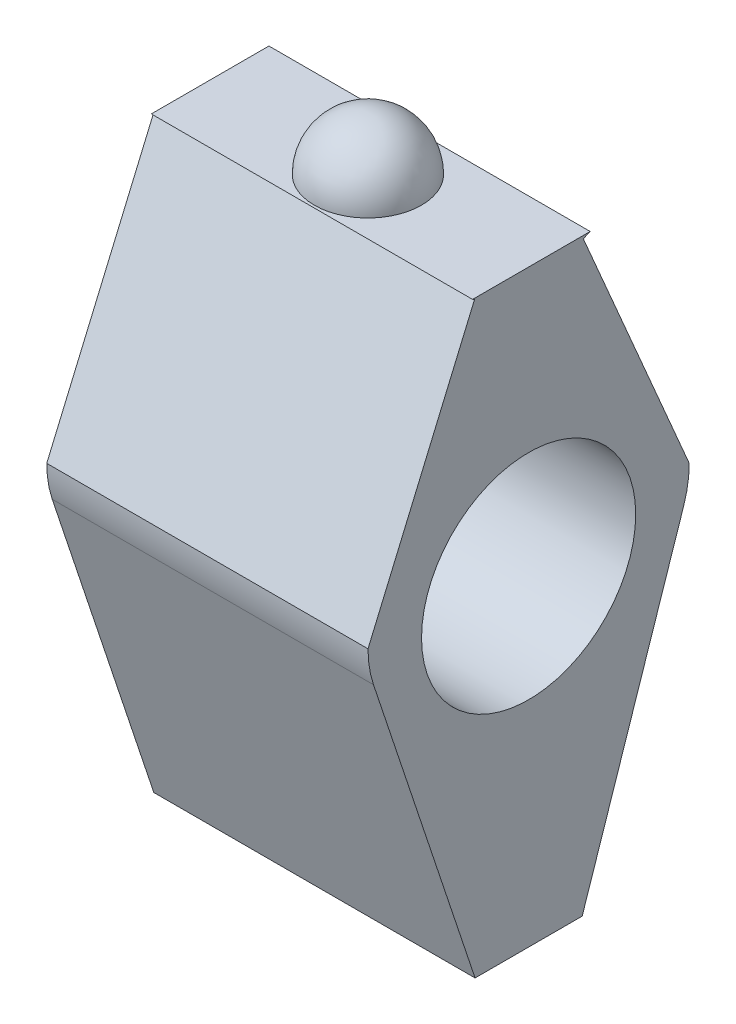
ISO-10303-21;
HEADER;
FILE_DESCRIPTION(('STEP AP214'),'2;1');
FILE_NAME('part.step','',(''),(''),'','','');
FILE_SCHEMA(('AUTOMOTIVE_DESIGN { 1 0 10303 214 1 1 1 1 }'));
ENDSEC;
DATA;
#1=APPLICATION_CONTEXT('core data for automotive mechanical design processes');
#2=APPLICATION_PROTOCOL_DEFINITION('international standard','automotive_design',2000,#1);
#3=PRODUCT_CONTEXT('',#1,'mechanical');
#4=PRODUCT('Part','Part','',(#3));
#5=PRODUCT_RELATED_PRODUCT_CATEGORY('part','',(#4));
#6=PRODUCT_DEFINITION_FORMATION('','',#4);
#7=PRODUCT_DEFINITION_CONTEXT('part definition',#1,'design');
#8=PRODUCT_DEFINITION('design','',#6,#7);
#9=PRODUCT_DEFINITION_SHAPE('','',#8);
#10=(LENGTH_UNIT() NAMED_UNIT(*) SI_UNIT(.MILLI.,.METRE.));
#11=(NAMED_UNIT(*) PLANE_ANGLE_UNIT() SI_UNIT($,.RADIAN.));
#12=(NAMED_UNIT(*) SI_UNIT($,.STERADIAN.) SOLID_ANGLE_UNIT());
#13=UNCERTAINTY_MEASURE_WITH_UNIT(LENGTH_MEASURE(1.E-05),#10,'distance_accuracy_value','');
#14=(GEOMETRIC_REPRESENTATION_CONTEXT(3) GLOBAL_UNCERTAINTY_ASSIGNED_CONTEXT((#13)) GLOBAL_UNIT_ASSIGNED_CONTEXT((#10,
#11,#12)) REPRESENTATION_CONTEXT('',''));
#15=CARTESIAN_POINT('',(0.,0.,0.));
#16=DIRECTION('',(0.,0.,1.));
#17=DIRECTION('',(1.,0.,0.));
#18=AXIS2_PLACEMENT_3D('',#15,#16,#17);
#19=CARTESIAN_POINT('',(-38.1,76.2,76.2));
#20=DIRECTION('',(1.,0.,0.));
#21=DIRECTION('',(0.,1.,0.));
#22=AXIS2_PLACEMENT_3D('',#19,#20,#21);
#23=PLANE('',#22);
#24=CARTESIAN_POINT('',(-38.1,0.,38.1));
#25=DIRECTION('',(1.,0.,0.));
#26=DIRECTION('',(0.,1.,0.));
#27=AXIS2_PLACEMENT_3D('',#24,#25,#26);
#28=CIRCLE('',#27,25.4);
#29=CARTESIAN_POINT('',(-38.1,25.4,38.1));
#30=VERTEX_POINT('',#29);
#31=EDGE_CURVE('E172',#30,#30,#28,.T.);
#32=ORIENTED_EDGE('',*,*,#31,.T.);
#33=EDGE_LOOP('',(#32));
#34=FACE_BOUND('',#33,.T.);
#35=DIRECTION('',(0.,0.393600027716465,-0.91928179476241));
#36=VECTOR('',#35,1.);
#37=CARTESIAN_POINT('',(-38.1,46.398740013951,63.4402816814989));
#38=LINE('',#37,#36);
#39=CARTESIAN_POINT('',(-38.1,62.8037183463836,25.1252490023325));
#40=VERTEX_POINT('',#39);
#41=CARTESIAN_POINT('',(-38.1,63.5,23.4990320228518));
#42=VERTEX_POINT('',#41);
#43=EDGE_CURVE('E51',#40,#42,#38,.T.);
#44=ORIENTED_EDGE('',*,*,#43,.F.);
#45=DIRECTION('',(0.,0.91928179476241,0.393600027716465));
#46=VECTOR('',#45,1.);
#47=CARTESIAN_POINT('',(-38.1,92.6049783324327,37.8849673208336));
#48=LINE('',#47,#46);
#49=CARTESIAN_POINT('',(-38.1,4.12185256827685,0.));
#50=VERTEX_POINT('',#49);
#51=EDGE_CURVE('E115',#50,#40,#48,.T.);
#52=ORIENTED_EDGE('',*,*,#51,.F.);
#53=CARTESIAN_POINT('',(-38.1,4.12185256827683,25.4));
#54=DIRECTION('',(1.,0.,0.));
#55=DIRECTION('',(0.,1.,0.));
#56=AXIS2_PLACEMENT_3D('',#53,#54,#55);
#57=CIRCLE('',#56,25.4);
#58=CARTESIAN_POINT('',(-38.1,-3.91033268855086,1.30344422951695));
#59=VERTEX_POINT('',#58);
#60=EDGE_CURVE('E193',#50,#59,#57,.F.);
#61=ORIENTED_EDGE('',*,*,#60,.T.);
#62=DIRECTION('',(0.,-0.948683298050514,0.316227766016838));
#63=VECTOR('',#62,1.);
#64=CARTESIAN_POINT('',(-38.1,0.,0.));
#65=LINE('',#64,#63);
#66=CARTESIAN_POINT('',(-38.1,-76.2,25.4));
#67=VERTEX_POINT('',#66);
#68=EDGE_CURVE('E167',#59,#67,#65,.T.);
#69=ORIENTED_EDGE('',*,*,#68,.T.);
#70=DIRECTION('',(0.,0.,-1.));
#71=VECTOR('',#70,1.);
#72=CARTESIAN_POINT('',(-38.1,-76.2,76.2));
#73=LINE('',#72,#71);
#74=CARTESIAN_POINT('',(-38.1,-76.2,50.8));
#75=VERTEX_POINT('',#74);
#76=EDGE_CURVE('E178',#75,#67,#73,.T.);
#77=ORIENTED_EDGE('',*,*,#76,.F.);
#78=DIRECTION('',(0.,0.948683298050514,0.316227766016838));
#79=VECTOR('',#78,1.);
#80=CARTESIAN_POINT('',(-38.1,0.,76.2));
#81=LINE('',#80,#79);
#82=CARTESIAN_POINT('',(-38.1,-3.91033268855087,74.896555770483));
#83=VERTEX_POINT('',#82);
#84=EDGE_CURVE('E155',#75,#83,#81,.T.);
#85=ORIENTED_EDGE('',*,*,#84,.T.);
#86=CARTESIAN_POINT('',(-38.1,4.12185256827682,50.8));
#87=DIRECTION('',(1.,0.,0.));
#88=DIRECTION('',(0.,1.,0.));
#89=AXIS2_PLACEMENT_3D('',#86,#87,#88);
#90=CIRCLE('',#89,25.4);
#91=CARTESIAN_POINT('',(-38.1,4.12185256827687,76.2));
#92=VERTEX_POINT('',#91);
#93=EDGE_CURVE('E190',#83,#92,#90,.F.);
#94=ORIENTED_EDGE('',*,*,#93,.T.);
#95=DIRECTION('',(0.,0.919543483974544,-0.392988270919067));
#96=VECTOR('',#95,1.);
#97=CARTESIAN_POINT('',(-38.1,65.0682666899958,50.153134004183));
#98=LINE('',#97,#96);
#99=CARTESIAN_POINT('',(-38.1,63.2914199916073,50.9125107208443));
#100=VERTEX_POINT('',#99);
#101=EDGE_CURVE('E144',#92,#100,#98,.T.);
#102=ORIENTED_EDGE('',*,*,#101,.T.);
#103=DIRECTION('',(0.,0.392988270919067,0.919543483974544));
#104=VECTOR('',#103,1.);
#105=CARTESIAN_POINT('',(-38.1,74.4231533016115,76.9593767166614));
#106=LINE('',#105,#104);
#107=CARTESIAN_POINT('',(-38.1,63.5,51.4005618964082));
#108=VERTEX_POINT('',#107);
#109=EDGE_CURVE('E139',#100,#108,#106,.T.);
#110=ORIENTED_EDGE('',*,*,#109,.T.);
#111=DIRECTION('',(0.,0.,1.));
#112=VECTOR('',#111,1.);
#113=CARTESIAN_POINT('',(-38.1,63.5,0.));
#114=LINE('',#113,#112);
#115=EDGE_CURVE('E132',#42,#108,#114,.T.);
#116=ORIENTED_EDGE('',*,*,#115,.F.);
#117=EDGE_LOOP('',(#44,#52,#61,#69,#77,#85,#94,#102,#110,#116));
#118=FACE_BOUND('',#117,.T.);
#119=ADVANCED_FACE('F36',(#34,#118),#23,.F.);
#120=CARTESIAN_POINT('',(38.1,76.2,76.2));
#121=DIRECTION('',(-1.,0.,0.));
#122=DIRECTION('',(0.,0.,1.));
#123=AXIS2_PLACEMENT_3D('',#120,#121,#122);
#124=PLANE('',#123);
#125=CARTESIAN_POINT('',(38.1,0.,38.1));
#126=DIRECTION('',(1.,0.,0.));
#127=DIRECTION('',(0.,0.,-1.));
#128=AXIS2_PLACEMENT_3D('',#125,#126,#127);
#129=CIRCLE('',#128,25.4);
#130=CARTESIAN_POINT('',(38.1,0.,12.7));
#131=VERTEX_POINT('',#130);
#132=EDGE_CURVE('E164',#131,#131,#129,.T.);
#133=ORIENTED_EDGE('',*,*,#132,.F.);
#134=EDGE_LOOP('',(#133));
#135=FACE_BOUND('',#134,.T.);
#136=DIRECTION('',(0.,-0.393600027716465,0.91928179476241));
#137=VECTOR('',#136,1.);
#138=CARTESIAN_POINT('',(38.1,46.398740013951,63.4402816814989));
#139=LINE('',#138,#137);
#140=CARTESIAN_POINT('',(38.1,63.5,23.4990320228518));
#141=VERTEX_POINT('',#140);
#142=CARTESIAN_POINT('',(38.1,62.8037183463836,25.1252490023325));
#143=VERTEX_POINT('',#142);
#144=EDGE_CURVE('E128',#141,#143,#139,.T.);
#145=ORIENTED_EDGE('',*,*,#144,.F.);
#146=DIRECTION('',(0.,0.,-1.));
#147=VECTOR('',#146,1.);
#148=CARTESIAN_POINT('',(38.1,63.5,0.));
#149=LINE('',#148,#147);
#150=CARTESIAN_POINT('',(38.1,63.5,51.4005618964082));
#151=VERTEX_POINT('',#150);
#152=EDGE_CURVE('E151',#151,#141,#149,.T.);
#153=ORIENTED_EDGE('',*,*,#152,.F.);
#154=DIRECTION('',(0.,-0.392988270919067,-0.919543483974544));
#155=VECTOR('',#154,1.);
#156=CARTESIAN_POINT('',(38.1,74.4231533016115,76.9593767166614));
#157=LINE('',#156,#155);
#158=CARTESIAN_POINT('',(38.1,63.2914199916073,50.9125107208443));
#159=VERTEX_POINT('',#158);
#160=EDGE_CURVE('E58',#151,#159,#157,.T.);
#161=ORIENTED_EDGE('',*,*,#160,.T.);
#162=DIRECTION('',(0.,-0.919543483974544,0.392988270919067));
#163=VECTOR('',#162,1.);
#164=CARTESIAN_POINT('',(38.1,65.0682666899958,50.153134004183));
#165=LINE('',#164,#163);
#166=CARTESIAN_POINT('',(38.1,4.12185256827687,76.2));
#167=VERTEX_POINT('',#166);
#168=EDGE_CURVE('E141',#159,#167,#165,.T.);
#169=ORIENTED_EDGE('',*,*,#168,.T.);
#170=CARTESIAN_POINT('',(38.1,4.12185256827682,50.8));
#171=DIRECTION('',(-1.,0.,0.));
#172=DIRECTION('',(0.,0.,1.));
#173=AXIS2_PLACEMENT_3D('',#170,#171,#172);
#174=CIRCLE('',#173,25.4);
#175=CARTESIAN_POINT('',(38.1,-3.91033268855087,74.896555770483));
#176=VERTEX_POINT('',#175);
#177=EDGE_CURVE('E184',#167,#176,#174,.F.);
#178=ORIENTED_EDGE('',*,*,#177,.T.);
#179=DIRECTION('',(0.,0.948683298050514,0.316227766016838));
#180=VECTOR('',#179,1.);
#181=CARTESIAN_POINT('',(38.1,0.,76.2));
#182=LINE('',#181,#180);
#183=CARTESIAN_POINT('',(38.1,-76.2,50.8));
#184=VERTEX_POINT('',#183);
#185=EDGE_CURVE('E159',#184,#176,#182,.T.);
#186=ORIENTED_EDGE('',*,*,#185,.F.);
#187=DIRECTION('',(0.,0.,-1.));
#188=VECTOR('',#187,1.);
#189=CARTESIAN_POINT('',(38.1,-76.2,76.2));
#190=LINE('',#189,#188);
#191=CARTESIAN_POINT('',(38.1,-76.2,25.4));
#192=VERTEX_POINT('',#191);
#193=EDGE_CURVE('E175',#184,#192,#190,.T.);
#194=ORIENTED_EDGE('',*,*,#193,.T.);
#195=DIRECTION('',(0.,-0.948683298050514,0.316227766016838));
#196=VECTOR('',#195,1.);
#197=CARTESIAN_POINT('',(38.1,0.,0.));
#198=LINE('',#197,#196);
#199=CARTESIAN_POINT('',(38.1,-3.91033268855086,1.30344422951695));
#200=VERTEX_POINT('',#199);
#201=EDGE_CURVE('E162',#200,#192,#198,.T.);
#202=ORIENTED_EDGE('',*,*,#201,.F.);
#203=CARTESIAN_POINT('',(38.1,4.12185256827683,25.4));
#204=DIRECTION('',(-1.,0.,0.));
#205=DIRECTION('',(0.,0.,1.));
#206=AXIS2_PLACEMENT_3D('',#203,#204,#205);
#207=CIRCLE('',#206,25.4);
#208=CARTESIAN_POINT('',(38.1,4.12185256827685,0.));
#209=VERTEX_POINT('',#208);
#210=EDGE_CURVE('E186',#200,#209,#207,.F.);
#211=ORIENTED_EDGE('',*,*,#210,.T.);
#212=DIRECTION('',(0.,-0.91928179476241,-0.393600027716465));
#213=VECTOR('',#212,1.);
#214=CARTESIAN_POINT('',(38.1,92.6049783324327,37.8849673208336));
#215=LINE('',#214,#213);
#216=EDGE_CURVE('E124',#143,#209,#215,.T.);
#217=ORIENTED_EDGE('',*,*,#216,.F.);
#218=EDGE_LOOP('',(#145,#153,#161,#169,#178,#186,#194,#202,#211,#217));
#219=FACE_BOUND('',#218,.T.);
#220=ADVANCED_FACE('F207',(#135,#219),#124,.F.);
#221=CARTESIAN_POINT('',(0.,63.5,0.));
#222=DIRECTION('',(0.,1.,0.));
#223=DIRECTION('',(0.,0.,1.));
#224=AXIS2_PLACEMENT_3D('',#221,#222,#223);
#225=PLANE('',#224);
#226=CARTESIAN_POINT('',(0.,63.5,38.1233692084797));
#227=DIRECTION('',(0.,1.,0.));
#228=DIRECTION('',(0.,0.,1.));
#229=AXIS2_PLACEMENT_3D('',#226,#227,#228);
#230=CIRCLE('',#229,12.7);
#231=CARTESIAN_POINT('',(0.,63.5,50.8233692084797));
#232=VERTEX_POINT('',#231);
#233=EDGE_CURVE('E147',#232,#232,#230,.T.);
#234=ORIENTED_EDGE('',*,*,#233,.F.);
#235=EDGE_LOOP('',(#234));
#236=FACE_BOUND('',#235,.T.);
#237=ORIENTED_EDGE('',*,*,#152,.T.);
#238=DIRECTION('',(-1.,0.,0.));
#239=VECTOR('',#238,1.);
#240=CARTESIAN_POINT('',(0.,63.5,23.4990320228518));
#241=LINE('',#240,#239);
#242=EDGE_CURVE('E11',#141,#42,#241,.T.);
#243=ORIENTED_EDGE('',*,*,#242,.T.);
#244=ORIENTED_EDGE('',*,*,#115,.T.);
#245=DIRECTION('',(-1.,0.,0.));
#246=VECTOR('',#245,1.);
#247=CARTESIAN_POINT('',(0.,63.5,51.4005618964082));
#248=LINE('',#247,#246);
#249=EDGE_CURVE('E44',#151,#108,#248,.T.);
#250=ORIENTED_EDGE('',*,*,#249,.F.);
#251=EDGE_LOOP('',(#237,#243,#244,#250));
#252=FACE_BOUND('',#251,.T.);
#253=ADVANCED_FACE('F209',(#236,#252),#225,.T.);
#254=CARTESIAN_POINT('',(-38.1,-76.2,76.2));
#255=DIRECTION('',(0.,1.,0.));
#256=DIRECTION('',(0.,0.,1.));
#257=AXIS2_PLACEMENT_3D('',#254,#255,#256);
#258=PLANE('',#257);
#259=ORIENTED_EDGE('',*,*,#193,.F.);
#260=DIRECTION('',(1.,0.,0.));
#261=VECTOR('',#260,1.);
#262=CARTESIAN_POINT('',(-38.1,-76.2,50.8));
#263=LINE('',#262,#261);
#264=EDGE_CURVE('E158',#75,#184,#263,.T.);
#265=ORIENTED_EDGE('',*,*,#264,.F.);
#266=ORIENTED_EDGE('',*,*,#76,.T.);
#267=DIRECTION('',(1.,0.,0.));
#268=VECTOR('',#267,1.);
#269=CARTESIAN_POINT('',(-38.1,-76.2,25.4));
#270=LINE('',#269,#268);
#271=EDGE_CURVE('E154',#67,#192,#270,.T.);
#272=ORIENTED_EDGE('',*,*,#271,.T.);
#273=EDGE_LOOP('',(#259,#265,#266,#272));
#274=FACE_BOUND('',#273,.T.);
#275=ADVANCED_FACE('F211',(#274),#258,.F.);
#276=CARTESIAN_POINT('',(-63.5,0.,38.1));
#277=DIRECTION('',(1.,0.,0.));
#278=DIRECTION('',(0.,0.,-1.));
#279=AXIS2_PLACEMENT_3D('',#276,#277,#278);
#280=CYLINDRICAL_SURFACE('',#279,25.4);
#281=ORIENTED_EDGE('',*,*,#132,.T.);
#282=EDGE_LOOP('',(#281));
#283=FACE_BOUND('',#282,.T.);
#284=ORIENTED_EDGE('',*,*,#31,.F.);
#285=EDGE_LOOP('',(#284));
#286=FACE_BOUND('',#285,.T.);
#287=ADVANCED_FACE('F219',(#283,#286),#280,.F.);
#288=CARTESIAN_POINT('',(-38.1,0.,0.));
#289=DIRECTION('',(0.,0.316227766016838,0.948683298050514));
#290=DIRECTION('',(0.,-0.948683298050514,0.316227766016838));
#291=AXIS2_PLACEMENT_3D('',#288,#289,#290);
#292=PLANE('',#291);
#293=ORIENTED_EDGE('',*,*,#68,.F.);
#294=DIRECTION('',(1.,0.,0.));
#295=VECTOR('',#294,1.);
#296=CARTESIAN_POINT('',(-38.1,-3.91033268855086,1.30344422951695));
#297=LINE('',#296,#295);
#298=EDGE_CURVE('E181',#59,#200,#297,.T.);
#299=ORIENTED_EDGE('',*,*,#298,.T.);
#300=ORIENTED_EDGE('',*,*,#201,.T.);
#301=ORIENTED_EDGE('',*,*,#271,.F.);
#302=EDGE_LOOP('',(#293,#299,#300,#301));
#303=FACE_BOUND('',#302,.T.);
#304=ADVANCED_FACE('F256',(#303),#292,.F.);
#305=CARTESIAN_POINT('',(-38.1,0.,76.2));
#306=DIRECTION('',(0.,0.316227766016838,-0.948683298050514));
#307=DIRECTION('',(0.,0.948683298050514,0.316227766016838));
#308=AXIS2_PLACEMENT_3D('',#305,#306,#307);
#309=PLANE('',#308);
#310=ORIENTED_EDGE('',*,*,#185,.T.);
#311=DIRECTION('',(1.,0.,0.));
#312=VECTOR('',#311,1.);
#313=CARTESIAN_POINT('',(-38.1,-3.91033268855087,74.896555770483));
#314=LINE('',#313,#312);
#315=EDGE_CURVE('E197',#176,#83,#314,.F.);
#316=ORIENTED_EDGE('',*,*,#315,.T.);
#317=ORIENTED_EDGE('',*,*,#84,.F.);
#318=ORIENTED_EDGE('',*,*,#264,.T.);
#319=EDGE_LOOP('',(#310,#316,#317,#318));
#320=FACE_BOUND('',#319,.T.);
#321=ADVANCED_FACE('F236',(#320),#309,.F.);
#322=CARTESIAN_POINT('',(-38.1,4.12185256827683,25.4));
#323=DIRECTION('',(1.,0.,0.));
#324=DIRECTION('',(0.,0.,-1.));
#325=AXIS2_PLACEMENT_3D('',#322,#323,#324);
#326=CYLINDRICAL_SURFACE('',#325,25.4);
#327=ORIENTED_EDGE('',*,*,#60,.F.);
#328=DIRECTION('',(1.,0.,0.));
#329=VECTOR('',#328,1.);
#330=CARTESIAN_POINT('',(0.,4.12185256827683,0.));
#331=LINE('',#330,#329);
#332=EDGE_CURVE('E120',#209,#50,#331,.F.);
#333=ORIENTED_EDGE('',*,*,#332,.F.);
#334=ORIENTED_EDGE('',*,*,#210,.F.);
#335=ORIENTED_EDGE('',*,*,#298,.F.);
#336=EDGE_LOOP('',(#327,#333,#334,#335));
#337=FACE_BOUND('',#336,.T.);
#338=ADVANCED_FACE('F234',(#337),#326,.T.);
#339=CARTESIAN_POINT('',(0.,4.12185256827682,50.8));
#340=DIRECTION('',(-1.,0.,0.));
#341=DIRECTION('',(0.,0.,1.));
#342=AXIS2_PLACEMENT_3D('',#339,#340,#341);
#343=CYLINDRICAL_SURFACE('',#342,25.4);
#344=ORIENTED_EDGE('',*,*,#93,.F.);
#345=ORIENTED_EDGE('',*,*,#315,.F.);
#346=ORIENTED_EDGE('',*,*,#177,.F.);
#347=DIRECTION('',(1.,0.,0.));
#348=VECTOR('',#347,1.);
#349=CARTESIAN_POINT('',(38.1,4.12185256827682,76.2));
#350=LINE('',#349,#348);
#351=EDGE_CURVE('E195',#92,#167,#350,.T.);
#352=ORIENTED_EDGE('',*,*,#351,.F.);
#353=EDGE_LOOP('',(#344,#345,#346,#352));
#354=FACE_BOUND('',#353,.T.);
#355=ADVANCED_FACE('F235',(#354),#343,.T.);
#356=CARTESIAN_POINT('',(0.,63.5,38.1233692084797));
#357=DIRECTION('',(0.,-1.,0.));
#358=DIRECTION('',(0.,0.,-1.));
#359=AXIS2_PLACEMENT_3D('',#356,#357,#358);
#360=SPHERICAL_SURFACE('',#359,12.7);
#361=ORIENTED_EDGE('',*,*,#233,.T.);
#362=EDGE_LOOP('',(#361));
#363=FACE_BOUND('',#362,.T.);
#364=ADVANCED_FACE('F38',(#363),#360,.T.);
#365=CARTESIAN_POINT('',(0.,28.1729570580048,65.9212017356064));
#366=DIRECTION('',(0.,-0.392988270919067,-0.919543483974544));
#367=DIRECTION('',(0.,0.919543483974544,-0.392988270919067));
#368=AXIS2_PLACEMENT_3D('',#365,#366,#367);
#369=PLANE('',#368);
#370=ORIENTED_EDGE('',*,*,#351,.T.);
#371=ORIENTED_EDGE('',*,*,#168,.F.);
#372=DIRECTION('',(1.,0.,0.));
#373=VECTOR('',#372,1.);
#374=CARTESIAN_POINT('',(41.8518036175046,63.2914199916073,50.9125107208443));
#375=LINE('',#374,#373);
#376=EDGE_CURVE('E123',#100,#159,#375,.T.);
#377=ORIENTED_EDGE('',*,*,#376,.F.);
#378=ORIENTED_EDGE('',*,*,#101,.F.);
#379=EDGE_LOOP('',(#370,#371,#377,#378));
#380=FACE_BOUND('',#379,.T.);
#381=ADVANCED_FACE('F205',(#380),#369,.F.);
#382=CARTESIAN_POINT('',(41.8518036175046,73.2733220729516,74.2689152137977));
#383=DIRECTION('',(0.,0.919543483974544,-0.392988270919067));
#384=DIRECTION('',(0.,0.392988270919067,0.919543483974544));
#385=AXIS2_PLACEMENT_3D('',#382,#383,#384);
#386=PLANE('',#385);
#387=ORIENTED_EDGE('',*,*,#376,.T.);
#388=ORIENTED_EDGE('',*,*,#160,.F.);
#389=ORIENTED_EDGE('',*,*,#249,.T.);
#390=ORIENTED_EDGE('',*,*,#109,.F.);
#391=EDGE_LOOP('',(#387,#388,#389,#390));
#392=FACE_BOUND('',#391,.T.);
#393=ADVANCED_FACE('F198',(#392),#386,.F.);
#394=CARTESIAN_POINT('',(0.,0.638561446788152,-1.49140719393536));
#395=DIRECTION('',(0.,0.393600027716465,-0.91928179476241));
#396=DIRECTION('',(0.,0.91928179476241,0.393600027716465));
#397=AXIS2_PLACEMENT_3D('',#394,#395,#396);
#398=PLANE('',#397);
#399=ORIENTED_EDGE('',*,*,#51,.T.);
#400=DIRECTION('',(1.,0.,0.));
#401=VECTOR('',#400,1.);
#402=CARTESIAN_POINT('',(39.7726397353093,62.8037183463836,25.1252490023325));
#403=LINE('',#402,#401);
#404=EDGE_CURVE('E117',#40,#143,#403,.T.);
#405=ORIENTED_EDGE('',*,*,#404,.T.);
#406=ORIENTED_EDGE('',*,*,#216,.T.);
#407=ORIENTED_EDGE('',*,*,#332,.T.);
#408=EDGE_LOOP('',(#399,#405,#406,#407));
#409=FACE_BOUND('',#408,.T.);
#410=ADVANCED_FACE('F116',(#409),#398,.T.);
#411=CARTESIAN_POINT('',(39.7726397353093,72.8011590503818,1.77549141536733));
#412=DIRECTION('',(0.,-0.91928179476241,-0.393600027716465));
#413=DIRECTION('',(0.,0.393600027716465,-0.91928179476241));
#414=AXIS2_PLACEMENT_3D('',#411,#412,#413);
#415=PLANE('',#414);
#416=ORIENTED_EDGE('',*,*,#43,.T.);
#417=ORIENTED_EDGE('',*,*,#242,.F.);
#418=ORIENTED_EDGE('',*,*,#144,.T.);
#419=ORIENTED_EDGE('',*,*,#404,.F.);
#420=EDGE_LOOP('',(#416,#417,#418,#419));
#421=FACE_BOUND('',#420,.T.);
#422=ADVANCED_FACE('F126',(#421),#415,.T.);
#423=CLOSED_SHELL('',(#119,#220,#253,#275,#287,#304,#321,#338,#355,#364,#381,#393,#410,#422));
#424=MANIFOLD_SOLID_BREP('B2',#423);
#425=ADVANCED_BREP_SHAPE_REPRESENTATION('',(#18,#424),#14);
#426=SHAPE_DEFINITION_REPRESENTATION(#9,#425);
ENDSEC;
END-ISO-10303-21;
